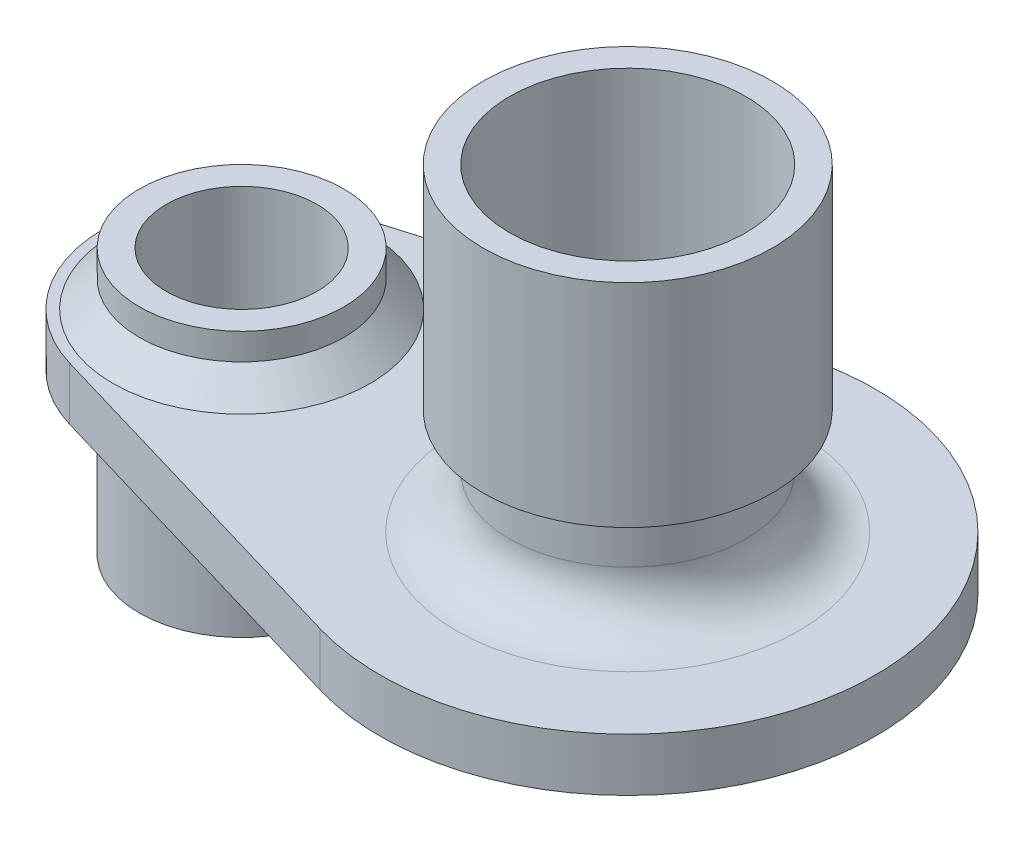
ISO-10303-21;
HEADER;
FILE_DESCRIPTION(('STEP AP214'),'2;1');
FILE_NAME('part.step','',(''),(''),'','','');
FILE_SCHEMA(('AUTOMOTIVE_DESIGN { 1 0 10303 214 1 1 1 1 }'));
ENDSEC;
DATA;
#1=APPLICATION_CONTEXT('core data for automotive mechanical design processes');
#2=APPLICATION_PROTOCOL_DEFINITION('international standard','automotive_design',2000,#1);
#3=PRODUCT_CONTEXT('',#1,'mechanical');
#4=PRODUCT('Part','Part','',(#3));
#5=PRODUCT_RELATED_PRODUCT_CATEGORY('part','',(#4));
#6=PRODUCT_DEFINITION_FORMATION('','',#4);
#7=PRODUCT_DEFINITION_CONTEXT('part definition',#1,'design');
#8=PRODUCT_DEFINITION('design','',#6,#7);
#9=PRODUCT_DEFINITION_SHAPE('','',#8);
#10=(LENGTH_UNIT() NAMED_UNIT(*) SI_UNIT(.MILLI.,.METRE.));
#11=(NAMED_UNIT(*) PLANE_ANGLE_UNIT() SI_UNIT($,.RADIAN.));
#12=(NAMED_UNIT(*) SI_UNIT($,.STERADIAN.) SOLID_ANGLE_UNIT());
#13=UNCERTAINTY_MEASURE_WITH_UNIT(LENGTH_MEASURE(1.E-05),#10,'distance_accuracy_value','');
#14=(GEOMETRIC_REPRESENTATION_CONTEXT(3) GLOBAL_UNCERTAINTY_ASSIGNED_CONTEXT((#13)) GLOBAL_UNIT_ASSIGNED_CONTEXT((#10,
#11,#12)) REPRESENTATION_CONTEXT('',''));
#15=CARTESIAN_POINT('',(0.,0.,0.));
#16=DIRECTION('',(0.,0.,1.));
#17=DIRECTION('',(1.,0.,0.));
#18=AXIS2_PLACEMENT_3D('',#15,#16,#17);
#19=CARTESIAN_POINT('',(369.824,330.2,0.));
#20=DIRECTION('',(0.,1.,0.));
#21=DIRECTION('',(0.,0.,1.));
#22=AXIS2_PLACEMENT_3D('',#19,#20,#21);
#23=PLANE('',#22);
#24=CARTESIAN_POINT('',(369.824,330.2,0.));
#25=DIRECTION('',(0.,1.,0.));
#26=DIRECTION('',(0.,0.,1.));
#27=AXIS2_PLACEMENT_3D('',#24,#25,#26);
#28=CIRCLE('',#27,138.557);
#29=CARTESIAN_POINT('',(369.824,330.2,138.557));
#30=VERTEX_POINT('',#29);
#31=EDGE_CURVE('E11',#30,#30,#28,.T.);
#32=ORIENTED_EDGE('',*,*,#31,.T.);
#33=EDGE_LOOP('',(#32));
#34=FACE_BOUND('',#33,.T.);
#35=CARTESIAN_POINT('',(369.824,330.2,0.));
#36=DIRECTION('',(0.,1.,0.));
#37=DIRECTION('',(0.,0.,1.));
#38=AXIS2_PLACEMENT_3D('',#35,#36,#37);
#39=CIRCLE('',#38,113.157);
#40=CARTESIAN_POINT('',(369.824,330.2,113.157));
#41=VERTEX_POINT('',#40);
#42=EDGE_CURVE('E59',#41,#41,#39,.T.);
#43=ORIENTED_EDGE('',*,*,#42,.F.);
#44=EDGE_LOOP('',(#43));
#45=FACE_BOUND('',#44,.T.);
#46=ADVANCED_FACE('F48',(#34,#45),#23,.T.);
#47=CARTESIAN_POINT('',(369.824,127.,0.));
#48=DIRECTION('',(0.,1.,0.));
#49=DIRECTION('',(0.,0.,1.));
#50=AXIS2_PLACEMENT_3D('',#47,#48,#49);
#51=PLANE('',#50);
#52=CARTESIAN_POINT('',(369.824,127.,0.));
#53=DIRECTION('',(0.,1.,0.));
#54=DIRECTION('',(0.,0.,1.));
#55=AXIS2_PLACEMENT_3D('',#52,#53,#54);
#56=CIRCLE('',#55,138.557);
#57=CARTESIAN_POINT('',(369.824,127.,138.557));
#58=VERTEX_POINT('',#57);
#59=EDGE_CURVE('E52',#58,#58,#56,.T.);
#60=ORIENTED_EDGE('',*,*,#59,.F.);
#61=EDGE_LOOP('',(#60));
#62=FACE_BOUND('',#61,.T.);
#63=CARTESIAN_POINT('',(369.824,127.,0.));
#64=DIRECTION('',(0.,1.,0.));
#65=DIRECTION('',(0.,0.,1.));
#66=AXIS2_PLACEMENT_3D('',#63,#64,#65);
#67=CIRCLE('',#66,113.157);
#68=CARTESIAN_POINT('',(369.824,127.,113.157));
#69=VERTEX_POINT('',#68);
#70=EDGE_CURVE('E61',#69,#69,#67,.T.);
#71=ORIENTED_EDGE('',*,*,#70,.T.);
#72=EDGE_LOOP('',(#71));
#73=FACE_BOUND('',#72,.T.);
#74=ADVANCED_FACE('F71',(#62,#73),#51,.F.);
#75=CARTESIAN_POINT('',(369.824,330.2,0.));
#76=DIRECTION('',(0.,-1.,0.));
#77=DIRECTION('',(0.,0.,-1.));
#78=AXIS2_PLACEMENT_3D('',#75,#76,#77);
#79=CYLINDRICAL_SURFACE('',#78,138.557);
#80=ORIENTED_EDGE('',*,*,#31,.F.);
#81=EDGE_LOOP('',(#80));
#82=FACE_BOUND('',#81,.T.);
#83=ORIENTED_EDGE('',*,*,#59,.T.);
#84=EDGE_LOOP('',(#83));
#85=FACE_BOUND('',#84,.T.);
#86=ADVANCED_FACE('F50',(#82,#85),#79,.T.);
#87=CARTESIAN_POINT('',(369.824,330.2,0.));
#88=DIRECTION('',(0.,-1.,0.));
#89=DIRECTION('',(0.,0.,-1.));
#90=AXIS2_PLACEMENT_3D('',#87,#88,#89);
#91=CYLINDRICAL_SURFACE('',#90,113.157);
#92=ORIENTED_EDGE('',*,*,#42,.T.);
#93=EDGE_LOOP('',(#92));
#94=FACE_BOUND('',#93,.T.);
#95=ORIENTED_EDGE('',*,*,#70,.F.);
#96=EDGE_LOOP('',(#95));
#97=FACE_BOUND('',#96,.T.);
#98=ADVANCED_FACE('F67',(#94,#97),#91,.F.);
#99=CLOSED_SHELL('',(#46,#74,#86,#98));
#100=MANIFOLD_SOLID_BREP('B2',#99);
#101=CARTESIAN_POINT('',(0.,25.4,0.));
#102=DIRECTION('',(0.,-1.,0.));
#103=DIRECTION('',(0.,0.,-1.));
#104=AXIS2_PLACEMENT_3D('',#101,#102,#103);
#105=CYLINDRICAL_SURFACE('',#104,132.588);
#106=CARTESIAN_POINT('',(0.,-25.4,0.));
#107=DIRECTION('',(0.,1.,0.));
#108=DIRECTION('',(0.,0.,1.));
#109=AXIS2_PLACEMENT_3D('',#106,#107,#108);
#110=CIRCLE('',#109,132.588);
#111=CARTESIAN_POINT('',(-37.518032967033,-25.4,-127.169080150344));
#112=VERTEX_POINT('',#111);
#113=CARTESIAN_POINT('',(-37.5180329670329,-25.4,127.169080150344));
#114=VERTEX_POINT('',#113);
#115=EDGE_CURVE('E183',#112,#114,#110,.T.);
#116=ORIENTED_EDGE('',*,*,#115,.T.);
#117=DIRECTION('',(0.,-1.,0.));
#118=VECTOR('',#117,1.);
#119=CARTESIAN_POINT('',(-37.5180329670329,25.4,127.169080150344));
#120=LINE('',#119,#118);
#121=CARTESIAN_POINT('',(-37.5180329670329,25.4,127.169080150344));
#122=VERTEX_POINT('',#121);
#123=EDGE_CURVE('E172',#122,#114,#120,.T.);
#124=ORIENTED_EDGE('',*,*,#123,.F.);
#125=CARTESIAN_POINT('',(0.,25.4,0.));
#126=DIRECTION('',(0.,1.,0.));
#127=DIRECTION('',(0.,0.,1.));
#128=AXIS2_PLACEMENT_3D('',#125,#126,#127);
#129=CIRCLE('',#128,132.588);
#130=CARTESIAN_POINT('',(-37.518032967033,25.4,-127.169080150344));
#131=VERTEX_POINT('',#130);
#132=EDGE_CURVE('E164',#131,#122,#129,.T.);
#133=ORIENTED_EDGE('',*,*,#132,.F.);
#134=DIRECTION('',(0.,-1.,0.));
#135=VECTOR('',#134,1.);
#136=CARTESIAN_POINT('',(-37.518032967033,25.4,-127.169080150344));
#137=LINE('',#136,#135);
#138=EDGE_CURVE('E179',#131,#112,#137,.T.);
#139=ORIENTED_EDGE('',*,*,#138,.T.);
#140=EDGE_LOOP('',(#116,#124,#133,#139));
#141=FACE_BOUND('',#140,.T.);
#142=ADVANCED_FACE('F109',(#141),#105,.T.);
#143=CARTESIAN_POINT('',(-37.5180329670329,25.4,127.169080150344));
#144=DIRECTION('',(0.282967032967032,0.,-0.959129635791656));
#145=DIRECTION('',(-0.959129635791656,0.,-0.282967032967032));
#146=AXIS2_PLACEMENT_3D('',#143,#144,#145);
#147=PLANE('',#146);
#148=DIRECTION('',(0.959129635791656,0.,0.282967032967032));
#149=VECTOR('',#148,1.);
#150=CARTESIAN_POINT('',(-37.5180329670329,-25.4,127.169080150344));
#151=LINE('',#150,#149);
#152=CARTESIAN_POINT('',(302.694032967033,-25.4,227.540078276669));
#153=VERTEX_POINT('',#152);
#154=EDGE_CURVE('E170',#114,#153,#151,.T.);
#155=ORIENTED_EDGE('',*,*,#154,.T.);
#156=DIRECTION('',(0.,-1.,0.));
#157=VECTOR('',#156,1.);
#158=CARTESIAN_POINT('',(302.694032967033,25.4,227.540078276669));
#159=LINE('',#158,#157);
#160=CARTESIAN_POINT('',(302.694032967033,25.4,227.540078276669));
#161=VERTEX_POINT('',#160);
#162=EDGE_CURVE('E168',#161,#153,#159,.T.);
#163=ORIENTED_EDGE('',*,*,#162,.F.);
#164=DIRECTION('',(0.959129635791656,0.,0.282967032967032));
#165=VECTOR('',#164,1.);
#166=CARTESIAN_POINT('',(-37.5180329670329,25.4,127.169080150344));
#167=LINE('',#166,#165);
#168=EDGE_CURVE('E159',#122,#161,#167,.T.);
#169=ORIENTED_EDGE('',*,*,#168,.F.);
#170=ORIENTED_EDGE('',*,*,#123,.T.);
#171=EDGE_LOOP('',(#155,#163,#169,#170));
#172=FACE_BOUND('',#171,.T.);
#173=ADVANCED_FACE('F169',(#172),#147,.F.);
#174=CARTESIAN_POINT('',(369.824,25.4,0.));
#175=DIRECTION('',(0.,-1.,0.));
#176=DIRECTION('',(0.,0.,-1.));
#177=AXIS2_PLACEMENT_3D('',#174,#175,#176);
#178=CYLINDRICAL_SURFACE('',#177,237.236);
#179=CARTESIAN_POINT('',(369.824,-25.4,0.));
#180=DIRECTION('',(0.,1.,0.));
#181=DIRECTION('',(0.,0.,1.));
#182=AXIS2_PLACEMENT_3D('',#179,#180,#181);
#183=CIRCLE('',#182,237.236);
#184=CARTESIAN_POINT('',(302.694032967033,-25.4,-227.540078276669));
#185=VERTEX_POINT('',#184);
#186=EDGE_CURVE('E145',#153,#185,#183,.T.);
#187=ORIENTED_EDGE('',*,*,#186,.T.);
#188=DIRECTION('',(0.,-1.,0.));
#189=VECTOR('',#188,1.);
#190=CARTESIAN_POINT('',(302.694032967033,25.4,-227.540078276669));
#191=LINE('',#190,#189);
#192=CARTESIAN_POINT('',(302.694032967033,25.4,-227.540078276669));
#193=VERTEX_POINT('',#192);
#194=EDGE_CURVE('E173',#193,#185,#191,.T.);
#195=ORIENTED_EDGE('',*,*,#194,.F.);
#196=CARTESIAN_POINT('',(369.824,25.4,0.));
#197=DIRECTION('',(0.,1.,0.));
#198=DIRECTION('',(0.,0.,1.));
#199=AXIS2_PLACEMENT_3D('',#196,#197,#198);
#200=CIRCLE('',#199,237.236);
#201=EDGE_CURVE('E162',#161,#193,#200,.T.);
#202=ORIENTED_EDGE('',*,*,#201,.F.);
#203=ORIENTED_EDGE('',*,*,#162,.T.);
#204=EDGE_LOOP('',(#187,#195,#202,#203));
#205=FACE_BOUND('',#204,.T.);
#206=ADVANCED_FACE('F175',(#205),#178,.T.);
#207=CARTESIAN_POINT('',(-37.518032967033,25.4,-127.169080150344));
#208=DIRECTION('',(0.282967032967033,0.,0.959129635791656));
#209=DIRECTION('',(0.959129635791656,0.,-0.282967032967033));
#210=AXIS2_PLACEMENT_3D('',#207,#208,#209);
#211=PLANE('',#210);
#212=DIRECTION('',(-0.959129635791656,0.,0.282967032967033));
#213=VECTOR('',#212,1.);
#214=CARTESIAN_POINT('',(-37.518032967033,-25.4,-127.169080150344));
#215=LINE('',#214,#213);
#216=EDGE_CURVE('E151',#185,#112,#215,.T.);
#217=ORIENTED_EDGE('',*,*,#216,.T.);
#218=ORIENTED_EDGE('',*,*,#138,.F.);
#219=DIRECTION('',(-0.959129635791656,0.,0.282967032967033));
#220=VECTOR('',#219,1.);
#221=CARTESIAN_POINT('',(-37.518032967033,25.4,-127.169080150344));
#222=LINE('',#221,#220);
#223=EDGE_CURVE('E128',#193,#131,#222,.T.);
#224=ORIENTED_EDGE('',*,*,#223,.F.);
#225=ORIENTED_EDGE('',*,*,#194,.T.);
#226=EDGE_LOOP('',(#217,#218,#224,#225));
#227=FACE_BOUND('',#226,.T.);
#228=ADVANCED_FACE('F237',(#227),#211,.F.);
#229=CARTESIAN_POINT('',(0.,25.4,0.));
#230=DIRECTION('',(0.,1.,0.));
#231=DIRECTION('',(0.,0.,1.));
#232=AXIS2_PLACEMENT_3D('',#229,#230,#231);
#233=PLANE('',#232);
#234=CARTESIAN_POINT('',(0.,25.4,0.));
#235=DIRECTION('',(0.,1.,0.));
#236=DIRECTION('',(0.,0.,1.));
#237=AXIS2_PLACEMENT_3D('',#234,#235,#236);
#238=CIRCLE('',#237,123.317);
#239=CARTESIAN_POINT('',(0.,25.4,123.317));
#240=VERTEX_POINT('',#239);
#241=EDGE_CURVE('E46',#240,#240,#238,.F.);
#242=ORIENTED_EDGE('',*,*,#241,.T.);
#243=EDGE_LOOP('',(#242));
#244=FACE_BOUND('',#243,.T.);
#245=CARTESIAN_POINT('',(369.824,25.4,0.));
#246=DIRECTION('',(0.,1.,0.));
#247=DIRECTION('',(0.,0.,1.));
#248=AXIS2_PLACEMENT_3D('',#245,#246,#247);
#249=CIRCLE('',#248,163.957);
#250=CARTESIAN_POINT('',(369.824,25.4,163.957));
#251=VERTEX_POINT('',#250);
#252=EDGE_CURVE('E208',#251,#251,#249,.F.);
#253=ORIENTED_EDGE('',*,*,#252,.T.);
#254=EDGE_LOOP('',(#253));
#255=FACE_BOUND('',#254,.T.);
#256=ORIENTED_EDGE('',*,*,#132,.T.);
#257=ORIENTED_EDGE('',*,*,#168,.T.);
#258=ORIENTED_EDGE('',*,*,#201,.T.);
#259=ORIENTED_EDGE('',*,*,#223,.T.);
#260=EDGE_LOOP('',(#256,#257,#258,#259));
#261=FACE_BOUND('',#260,.T.);
#262=ADVANCED_FACE('F160',(#244,#255,#261),#233,.T.);
#263=CARTESIAN_POINT('',(0.,-25.4,0.));
#264=DIRECTION('',(0.,1.,0.));
#265=DIRECTION('',(0.,0.,1.));
#266=AXIS2_PLACEMENT_3D('',#263,#264,#265);
#267=PLANE('',#266);
#268=CARTESIAN_POINT('',(369.824,-25.4,0.));
#269=DIRECTION('',(0.,1.,0.));
#270=DIRECTION('',(0.,0.,1.));
#271=AXIS2_PLACEMENT_3D('',#268,#269,#270);
#272=CIRCLE('',#271,38.1);
#273=CARTESIAN_POINT('',(369.824,-25.4,38.1));
#274=VERTEX_POINT('',#273);
#275=EDGE_CURVE('E283',#274,#274,#272,.T.);
#276=ORIENTED_EDGE('',*,*,#275,.T.);
#277=EDGE_LOOP('',(#276));
#278=FACE_BOUND('',#277,.T.);
#279=CARTESIAN_POINT('',(0.,-25.4,0.));
#280=DIRECTION('',(0.,1.,0.));
#281=DIRECTION('',(0.,0.,1.));
#282=AXIS2_PLACEMENT_3D('',#279,#280,#281);
#283=CIRCLE('',#282,97.917);
#284=CARTESIAN_POINT('',(0.,-25.4,97.917));
#285=VERTEX_POINT('',#284);
#286=EDGE_CURVE('E200',#285,#285,#283,.F.);
#287=ORIENTED_EDGE('',*,*,#286,.F.);
#288=EDGE_LOOP('',(#287));
#289=FACE_BOUND('',#288,.T.);
#290=ORIENTED_EDGE('',*,*,#115,.F.);
#291=ORIENTED_EDGE('',*,*,#216,.F.);
#292=ORIENTED_EDGE('',*,*,#186,.F.);
#293=ORIENTED_EDGE('',*,*,#154,.F.);
#294=EDGE_LOOP('',(#290,#291,#292,#293));
#295=FACE_BOUND('',#294,.T.);
#296=ADVANCED_FACE('F240',(#278,#289,#295),#267,.F.);
#297=CARTESIAN_POINT('',(0.,-177.8,0.));
#298=DIRECTION('',(0.,1.,0.));
#299=DIRECTION('',(0.,0.,1.));
#300=AXIS2_PLACEMENT_3D('',#297,#298,#299);
#301=CYLINDRICAL_SURFACE('',#300,97.917);
#302=CARTESIAN_POINT('',(0.,-177.8,0.));
#303=DIRECTION('',(0.,-1.,0.));
#304=DIRECTION('',(0.,0.,-1.));
#305=AXIS2_PLACEMENT_3D('',#302,#303,#304);
#306=CIRCLE('',#305,97.917);
#307=CARTESIAN_POINT('',(0.,-177.8,97.917));
#308=VERTEX_POINT('',#307);
#309=EDGE_CURVE('E187',#308,#308,#306,.T.);
#310=CARTESIAN_POINT('',(0.,-177.8,97.917));
#311=CARTESIAN_POINT('',(0.,-176.2125,97.917));
#312=CARTESIAN_POINT('',(0.,-174.625,97.917));
#313=CARTESIAN_POINT('',(0.,-171.45,97.917));
#314=CARTESIAN_POINT('',(0.,-169.8625,97.917));
#315=CARTESIAN_POINT('',(0.,-166.6875,97.917));
#316=CARTESIAN_POINT('',(0.,-165.1,97.917));
#317=CARTESIAN_POINT('',(0.,-161.925,97.917));
#318=CARTESIAN_POINT('',(0.,-160.3375,97.917));
#319=CARTESIAN_POINT('',(0.,-157.1625,97.917));
#320=CARTESIAN_POINT('',(0.,-155.575,97.917));
#321=CARTESIAN_POINT('',(0.,-152.4,97.917));
#322=CARTESIAN_POINT('',(0.,-150.8125,97.917));
#323=CARTESIAN_POINT('',(0.,-147.6375,97.917));
#324=CARTESIAN_POINT('',(0.,-146.05,97.917));
#325=CARTESIAN_POINT('',(0.,-142.875,97.917));
#326=CARTESIAN_POINT('',(0.,-141.2875,97.917));
#327=CARTESIAN_POINT('',(0.,-138.1125,97.917));
#328=CARTESIAN_POINT('',(0.,-136.525,97.917));
#329=CARTESIAN_POINT('',(0.,-133.35,97.917));
#330=CARTESIAN_POINT('',(0.,-131.7625,97.917));
#331=CARTESIAN_POINT('',(0.,-128.5875,97.917));
#332=CARTESIAN_POINT('',(0.,-127.,97.917));
#333=CARTESIAN_POINT('',(0.,-123.825,97.917));
#334=CARTESIAN_POINT('',(0.,-122.2375,97.917));
#335=CARTESIAN_POINT('',(0.,-119.0625,97.917));
#336=CARTESIAN_POINT('',(0.,-117.475,97.917));
#337=CARTESIAN_POINT('',(0.,-114.3,97.917));
#338=CARTESIAN_POINT('',(0.,-112.7125,97.917));
#339=CARTESIAN_POINT('',(0.,-109.5375,97.917));
#340=CARTESIAN_POINT('',(0.,-107.95,97.917));
#341=CARTESIAN_POINT('',(0.,-104.775,97.917));
#342=CARTESIAN_POINT('',(0.,-103.1875,97.917));
#343=CARTESIAN_POINT('',(0.,-100.0125,97.917));
#344=CARTESIAN_POINT('',(0.,-98.425,97.917));
#345=CARTESIAN_POINT('',(0.,-95.25,97.917));
#346=CARTESIAN_POINT('',(0.,-93.6625,97.917));
#347=CARTESIAN_POINT('',(0.,-90.4875,97.917));
#348=CARTESIAN_POINT('',(0.,-88.9,97.917));
#349=CARTESIAN_POINT('',(0.,-85.725,97.917));
#350=CARTESIAN_POINT('',(0.,-84.1375,97.917));
#351=CARTESIAN_POINT('',(0.,-80.9625,97.917));
#352=CARTESIAN_POINT('',(0.,-79.375,97.917));
#353=CARTESIAN_POINT('',(0.,-76.2,97.917));
#354=CARTESIAN_POINT('',(0.,-74.6125,97.917));
#355=CARTESIAN_POINT('',(0.,-71.4375,97.917));
#356=CARTESIAN_POINT('',(0.,-69.85,97.917));
#357=CARTESIAN_POINT('',(0.,-66.675,97.917));
#358=CARTESIAN_POINT('',(0.,-65.0875,97.917));
#359=CARTESIAN_POINT('',(0.,-61.9125,97.917));
#360=CARTESIAN_POINT('',(0.,-60.325,97.917));
#361=CARTESIAN_POINT('',(0.,-57.15,97.917));
#362=CARTESIAN_POINT('',(0.,-55.5625,97.917));
#363=CARTESIAN_POINT('',(0.,-52.3875,97.917));
#364=CARTESIAN_POINT('',(0.,-50.8,97.917));
#365=CARTESIAN_POINT('',(0.,-47.625,97.917));
#366=CARTESIAN_POINT('',(0.,-46.0375,97.917));
#367=CARTESIAN_POINT('',(0.,-42.8625,97.917));
#368=CARTESIAN_POINT('',(0.,-41.275,97.917));
#369=CARTESIAN_POINT('',(0.,-38.1,97.917));
#370=CARTESIAN_POINT('',(0.,-36.5125,97.917));
#371=CARTESIAN_POINT('',(0.,-33.3375,97.917));
#372=CARTESIAN_POINT('',(0.,-31.75,97.917));
#373=CARTESIAN_POINT('',(0.,-28.575,97.917));
#374=CARTESIAN_POINT('',(0.,-26.9875,97.917));
#375=CARTESIAN_POINT('',(0.,-25.4,97.917));
#376=B_SPLINE_CURVE_WITH_KNOTS('',3,(#310,#311,#312,#313,#314,#315,#316,#317,#318,#319,#320,
#321,#322,#323,#324,#325,#326,#327,#328,#329,#330,#331,#332,#333,#334,#335,#336,#337,#338,#339,
#340,#341,#342,#343,#344,#345,#346,#347,#348,#349,#350,#351,#352,#353,#354,#355,#356,#357,#358,
#359,#360,#361,#362,#363,#364,#365,#366,#367,#368,#369,#370,#371,#372,#373,#374,#375),
.UNSPECIFIED.,.F.,.F.,(4,2,2,2,2,2,2,2,2,2,2,2,2,2,2,2,2,2,2,2,2,2,2,2,2,2,2,2,2,2,2,2,4),(0.,
4.76249999999998,9.52499999999998,14.2875,19.05,23.8125,28.575,33.3375,38.1,42.8625,47.625,
52.3875,57.15,61.9125,66.675,71.4375,76.2,80.9625,85.725,90.4875,95.25,100.0125,104.775,
109.5375,114.3,119.0625,123.825,128.5875,133.35,138.1125,142.875,147.6375,152.4),.UNSPECIFIED.);
#377=EDGE_CURVE('BSEAM243',#308,#285,#376,.T.);
#378=ORIENTED_EDGE('',*,*,#309,.F.);
#379=ORIENTED_EDGE('',*,*,#286,.T.);
#380=ORIENTED_EDGE('',*,*,#377,.T.);
#381=ORIENTED_EDGE('',*,*,#377,.F.);
#382=EDGE_LOOP('',(#378,#380,#379,#381));
#383=FACE_BOUND('',#382,.T.);
#384=ADVANCED_FACE('F243',(#383),#301,.T.);
#385=CARTESIAN_POINT('',(0.,-177.8,0.));
#386=DIRECTION('',(0.,-1.,0.));
#387=DIRECTION('',(0.,0.,-1.));
#388=AXIS2_PLACEMENT_3D('',#385,#386,#387);
#389=PLANE('',#388);
#390=CARTESIAN_POINT('',(0.,-177.8,0.));
#391=DIRECTION('',(0.,-1.,0.));
#392=DIRECTION('',(0.,0.,-1.));
#393=AXIS2_PLACEMENT_3D('',#390,#391,#392);
#394=CIRCLE('',#393,72.263);
#395=CARTESIAN_POINT('',(0.,-177.8,-72.263));
#396=VERTEX_POINT('',#395);
#397=EDGE_CURVE('E290',#396,#396,#394,.T.);
#398=ORIENTED_EDGE('',*,*,#397,.F.);
#399=EDGE_LOOP('',(#398));
#400=FACE_BOUND('',#399,.T.);
#401=ORIENTED_EDGE('',*,*,#309,.T.);
#402=EDGE_LOOP('',(#401));
#403=FACE_BOUND('',#402,.T.);
#404=ADVANCED_FACE('F250',(#400,#403),#389,.T.);
#405=CARTESIAN_POINT('',(0.,76.2,0.));
#406=DIRECTION('',(0.,-1.,0.));
#407=DIRECTION('',(0.,0.,-1.));
#408=AXIS2_PLACEMENT_3D('',#405,#406,#407);
#409=CYLINDRICAL_SURFACE('',#408,97.917);
#410=CARTESIAN_POINT('',(0.,50.8000000000003,0.));
#411=DIRECTION('',(0.,1.,0.));
#412=DIRECTION('',(0.,0.,1.));
#413=AXIS2_PLACEMENT_3D('',#410,#411,#412);
#414=CIRCLE('',#413,97.917);
#415=CARTESIAN_POINT('',(0.,50.8000000000003,97.917));
#416=VERTEX_POINT('',#415);
#417=EDGE_CURVE('E120',#416,#416,#414,.T.);
#418=ORIENTED_EDGE('',*,*,#417,.T.);
#419=EDGE_LOOP('',(#418));
#420=FACE_BOUND('',#419,.T.);
#421=CARTESIAN_POINT('',(0.,76.2,0.));
#422=DIRECTION('',(0.,-1.,0.));
#423=DIRECTION('',(0.,0.,-1.));
#424=AXIS2_PLACEMENT_3D('',#421,#422,#423);
#425=CIRCLE('',#424,97.917);
#426=CARTESIAN_POINT('',(0.,76.2,-97.917));
#427=VERTEX_POINT('',#426);
#428=EDGE_CURVE('E298',#427,#427,#425,.T.);
#429=ORIENTED_EDGE('',*,*,#428,.T.);
#430=EDGE_LOOP('',(#429));
#431=FACE_BOUND('',#430,.T.);
#432=ADVANCED_FACE('F215',(#420,#431),#409,.T.);
#433=CARTESIAN_POINT('',(0.,76.2,0.));
#434=DIRECTION('',(0.,-1.,0.));
#435=DIRECTION('',(0.,0.,-1.));
#436=AXIS2_PLACEMENT_3D('',#433,#434,#435);
#437=PLANE('',#436);
#438=CARTESIAN_POINT('',(0.,76.2,0.));
#439=DIRECTION('',(0.,-1.,0.));
#440=DIRECTION('',(0.,0.,-1.));
#441=AXIS2_PLACEMENT_3D('',#438,#439,#440);
#442=CIRCLE('',#441,72.263);
#443=CARTESIAN_POINT('',(0.,76.2,-72.263));
#444=VERTEX_POINT('',#443);
#445=EDGE_CURVE('E294',#444,#444,#442,.T.);
#446=ORIENTED_EDGE('',*,*,#445,.T.);
#447=EDGE_LOOP('',(#446));
#448=FACE_BOUND('',#447,.T.);
#449=ORIENTED_EDGE('',*,*,#428,.F.);
#450=EDGE_LOOP('',(#449));
#451=FACE_BOUND('',#450,.T.);
#452=ADVANCED_FACE('F257',(#448,#451),#437,.F.);
#453=CARTESIAN_POINT('',(0.,76.2,0.));
#454=DIRECTION('',(0.,-1.,0.));
#455=DIRECTION('',(0.,0.,-1.));
#456=AXIS2_PLACEMENT_3D('',#453,#454,#455);
#457=CYLINDRICAL_SURFACE('',#456,72.263);
#458=ORIENTED_EDGE('',*,*,#445,.F.);
#459=EDGE_LOOP('',(#458));
#460=FACE_BOUND('',#459,.T.);
#461=ORIENTED_EDGE('',*,*,#397,.T.);
#462=EDGE_LOOP('',(#461));
#463=FACE_BOUND('',#462,.T.);
#464=ADVANCED_FACE('F260',(#460,#463),#457,.F.);
#465=CARTESIAN_POINT('',(369.824,127.,0.));
#466=DIRECTION('',(0.,-1.,0.));
#467=DIRECTION('',(0.,0.,-1.));
#468=AXIS2_PLACEMENT_3D('',#465,#466,#467);
#469=CYLINDRICAL_SURFACE('',#468,113.157);
#470=CARTESIAN_POINT('',(369.824,76.2,0.));
#471=DIRECTION('',(0.,1.,0.));
#472=DIRECTION('',(0.,0.,1.));
#473=AXIS2_PLACEMENT_3D('',#470,#471,#472);
#474=CIRCLE('',#473,113.157);
#475=CARTESIAN_POINT('',(369.824,76.2,113.157));
#476=VERTEX_POINT('',#475);
#477=EDGE_CURVE('E204',#476,#476,#474,.T.);
#478=ORIENTED_EDGE('',*,*,#477,.T.);
#479=EDGE_LOOP('',(#478));
#480=FACE_BOUND('',#479,.T.);
#481=CARTESIAN_POINT('',(369.824,127.,0.));
#482=DIRECTION('',(0.,1.,0.));
#483=DIRECTION('',(0.,0.,1.));
#484=AXIS2_PLACEMENT_3D('',#481,#482,#483);
#485=CIRCLE('',#484,113.157);
#486=CARTESIAN_POINT('',(369.824,127.,113.157));
#487=VERTEX_POINT('',#486);
#488=EDGE_CURVE('E285',#487,#487,#485,.T.);
#489=ORIENTED_EDGE('',*,*,#488,.F.);
#490=EDGE_LOOP('',(#489));
#491=FACE_BOUND('',#490,.T.);
#492=ADVANCED_FACE('F264',(#480,#491),#469,.T.);
#493=CARTESIAN_POINT('',(369.824,127.,0.));
#494=DIRECTION('',(0.,1.,0.));
#495=DIRECTION('',(0.,0.,1.));
#496=AXIS2_PLACEMENT_3D('',#493,#494,#495);
#497=PLANE('',#496);
#498=CARTESIAN_POINT('',(369.824,127.,0.));
#499=DIRECTION('',(0.,1.,0.));
#500=DIRECTION('',(0.,0.,1.));
#501=AXIS2_PLACEMENT_3D('',#498,#499,#500);
#502=CIRCLE('',#501,38.1);
#503=CARTESIAN_POINT('',(369.824,127.,38.1));
#504=VERTEX_POINT('',#503);
#505=EDGE_CURVE('E280',#504,#504,#502,.T.);
#506=ORIENTED_EDGE('',*,*,#505,.F.);
#507=EDGE_LOOP('',(#506));
#508=FACE_BOUND('',#507,.T.);
#509=ORIENTED_EDGE('',*,*,#488,.T.);
#510=EDGE_LOOP('',(#509));
#511=FACE_BOUND('',#510,.T.);
#512=ADVANCED_FACE('F268',(#508,#511),#497,.T.);
#513=CARTESIAN_POINT('',(369.824,-177.8,0.));
#514=DIRECTION('',(0.,1.,0.));
#515=DIRECTION('',(0.,0.,1.));
#516=AXIS2_PLACEMENT_3D('',#513,#514,#515);
#517=CYLINDRICAL_SURFACE('',#516,38.1);
#518=CARTESIAN_POINT('',(369.824,127.,38.1));
#519=CARTESIAN_POINT('',(369.824,125.4125,38.1));
#520=CARTESIAN_POINT('',(369.824,123.825,38.1));
#521=CARTESIAN_POINT('',(369.824,120.65,38.1));
#522=CARTESIAN_POINT('',(369.824,119.0625,38.1));
#523=CARTESIAN_POINT('',(369.824,115.8875,38.1));
#524=CARTESIAN_POINT('',(369.824,114.3,38.1));
#525=CARTESIAN_POINT('',(369.824,111.125,38.1));
#526=CARTESIAN_POINT('',(369.824,109.5375,38.1));
#527=CARTESIAN_POINT('',(369.824,106.3625,38.1));
#528=CARTESIAN_POINT('',(369.824,104.775,38.1));
#529=CARTESIAN_POINT('',(369.824,101.6,38.1));
#530=CARTESIAN_POINT('',(369.824,100.0125,38.1));
#531=CARTESIAN_POINT('',(369.824,96.8375,38.1));
#532=CARTESIAN_POINT('',(369.824,95.25,38.1));
#533=CARTESIAN_POINT('',(369.824,92.075,38.1));
#534=CARTESIAN_POINT('',(369.824,90.4875,38.1));
#535=CARTESIAN_POINT('',(369.824,87.3125,38.1));
#536=CARTESIAN_POINT('',(369.824,85.725,38.1));
#537=CARTESIAN_POINT('',(369.824,82.55,38.1));
#538=CARTESIAN_POINT('',(369.824,80.9625,38.1));
#539=CARTESIAN_POINT('',(369.824,77.7875,38.1));
#540=CARTESIAN_POINT('',(369.824,76.2,38.1));
#541=CARTESIAN_POINT('',(369.824,73.025,38.1));
#542=CARTESIAN_POINT('',(369.824,71.4375,38.1));
#543=CARTESIAN_POINT('',(369.824,68.2625,38.1));
#544=CARTESIAN_POINT('',(369.824,66.675,38.1));
#545=CARTESIAN_POINT('',(369.824,63.5,38.1));
#546=CARTESIAN_POINT('',(369.824,61.9125,38.1));
#547=CARTESIAN_POINT('',(369.824,58.7375,38.1));
#548=CARTESIAN_POINT('',(369.824,57.15,38.1));
#549=CARTESIAN_POINT('',(369.824,53.975,38.1));
#550=CARTESIAN_POINT('',(369.824,52.3875,38.1));
#551=CARTESIAN_POINT('',(369.824,49.2125,38.1));
#552=CARTESIAN_POINT('',(369.824,47.625,38.1));
#553=CARTESIAN_POINT('',(369.824,44.45,38.1));
#554=CARTESIAN_POINT('',(369.824,42.8625,38.1));
#555=CARTESIAN_POINT('',(369.824,39.6875,38.1));
#556=CARTESIAN_POINT('',(369.824,38.1,38.1));
#557=CARTESIAN_POINT('',(369.824,34.925,38.1));
#558=CARTESIAN_POINT('',(369.824,33.3375,38.1));
#559=CARTESIAN_POINT('',(369.824,30.1625,38.1));
#560=CARTESIAN_POINT('',(369.824,28.575,38.1));
#561=CARTESIAN_POINT('',(369.824,25.4,38.1));
#562=CARTESIAN_POINT('',(369.824,23.8125,38.1));
#563=CARTESIAN_POINT('',(369.824,20.6375,38.1));
#564=CARTESIAN_POINT('',(369.824,19.05,38.1));
#565=CARTESIAN_POINT('',(369.824,15.875,38.1));
#566=CARTESIAN_POINT('',(369.824,14.2875,38.1));
#567=CARTESIAN_POINT('',(369.824,11.1125,38.1));
#568=CARTESIAN_POINT('',(369.824,9.52500000000001,38.1));
#569=CARTESIAN_POINT('',(369.824,6.35000000000001,38.1));
#570=CARTESIAN_POINT('',(369.824,4.76250000000001,38.1));
#571=CARTESIAN_POINT('',(369.824,1.58750000000001,38.1));
#572=CARTESIAN_POINT('',(369.824,0.,38.1));
#573=CARTESIAN_POINT('',(369.824,-3.17499999999999,38.1));
#574=CARTESIAN_POINT('',(369.824,-4.76249999999999,38.1));
#575=CARTESIAN_POINT('',(369.824,-7.93749999999999,38.1));
#576=CARTESIAN_POINT('',(369.824,-9.525,38.1));
#577=CARTESIAN_POINT('',(369.824,-12.7,38.1));
#578=CARTESIAN_POINT('',(369.824,-14.2875,38.1));
#579=CARTESIAN_POINT('',(369.824,-17.4625,38.1));
#580=CARTESIAN_POINT('',(369.824,-19.05,38.1));
#581=CARTESIAN_POINT('',(369.824,-22.225,38.1));
#582=CARTESIAN_POINT('',(369.824,-23.8125,38.1));
#583=CARTESIAN_POINT('',(369.824,-25.4,38.1));
#584=B_SPLINE_CURVE_WITH_KNOTS('',3,(#518,#519,#520,#521,#522,#523,#524,#525,#526,#527,#528,
#529,#530,#531,#532,#533,#534,#535,#536,#537,#538,#539,#540,#541,#542,#543,#544,#545,#546,#547,
#548,#549,#550,#551,#552,#553,#554,#555,#556,#557,#558,#559,#560,#561,#562,#563,#564,#565,#566,
#567,#568,#569,#570,#571,#572,#573,#574,#575,#576,#577,#578,#579,#580,#581,#582,#583),
.UNSPECIFIED.,.F.,.F.,(4,2,2,2,2,2,2,2,2,2,2,2,2,2,2,2,2,2,2,2,2,2,2,2,2,2,2,2,2,2,2,2,4),(0.,
4.7625,9.52500000000001,14.2875,19.05,23.8125,28.575,33.3375,38.1,42.8625,47.625,52.3875,57.15,
61.9125,66.675,71.4375,76.2,80.9625,85.725,90.4875,95.25,100.0125,104.775,109.5375,114.3,
119.0625,123.825,128.5875,133.35,138.1125,142.875,147.6375,152.4),.UNSPECIFIED.);
#585=EDGE_CURVE('BSEAM224',#504,#274,#584,.T.);
#586=ORIENTED_EDGE('',*,*,#505,.T.);
#587=ORIENTED_EDGE('',*,*,#275,.F.);
#588=ORIENTED_EDGE('',*,*,#585,.T.);
#589=ORIENTED_EDGE('',*,*,#585,.F.);
#590=EDGE_LOOP('',(#586,#588,#587,#589));
#591=FACE_BOUND('',#590,.T.);
#592=ADVANCED_FACE('F224',(#591),#517,.F.);
#593=CARTESIAN_POINT('',(369.824,76.2,0.));
#594=DIRECTION('',(0.,1.,0.));
#595=DIRECTION('',(0.,0.,1.));
#596=AXIS2_PLACEMENT_3D('',#593,#594,#595);
#597=TOROIDAL_SURFACE('',#596,163.957,50.8);
#598=ORIENTED_EDGE('',*,*,#252,.F.);
#599=EDGE_LOOP('',(#598));
#600=FACE_BOUND('',#599,.T.);
#601=ORIENTED_EDGE('',*,*,#477,.F.);
#602=EDGE_LOOP('',(#601));
#603=FACE_BOUND('',#602,.T.);
#604=ADVANCED_FACE('F219',(#600,#603),#597,.F.);
#605=CARTESIAN_POINT('',(0.,50.8000000000003,0.));
#606=DIRECTION('',(0.,-1.,0.));
#607=DIRECTION('',(0.,0.,-1.));
#608=AXIS2_PLACEMENT_3D('',#605,#606,#607);
#609=CONICAL_SURFACE('',#608,97.917,0.785398163397443);
#610=ORIENTED_EDGE('',*,*,#241,.F.);
#611=EDGE_LOOP('',(#610));
#612=FACE_BOUND('',#611,.T.);
#613=ORIENTED_EDGE('',*,*,#417,.F.);
#614=EDGE_LOOP('',(#613));
#615=FACE_BOUND('',#614,.T.);
#616=ADVANCED_FACE('F112',(#612,#615),#609,.T.);
#617=CLOSED_SHELL('',(#142,#173,#206,#228,#262,#296,#384,#404,#432,#452,#464,#492,#512,#592,
#604,#616));
#618=MANIFOLD_SOLID_BREP('B6',#617);
#619=ADVANCED_BREP_SHAPE_REPRESENTATION('',(#18,#100,#618),#14);
#620=SHAPE_DEFINITION_REPRESENTATION(#9,#619);
ENDSEC;
END-ISO-10303-21;
